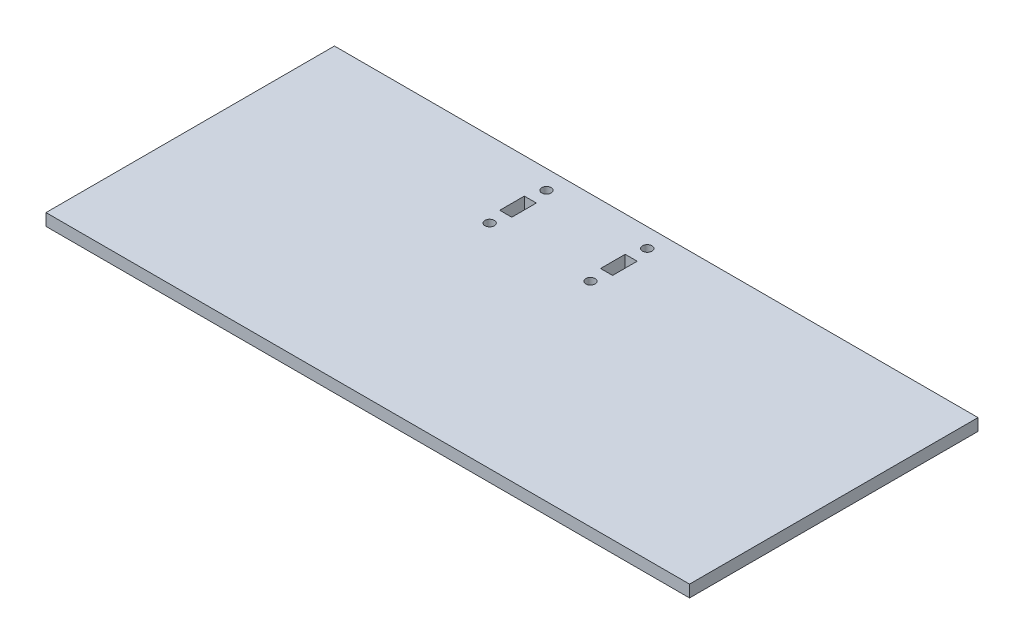
ISO-10303-21;
HEADER;
FILE_DESCRIPTION(('STEP AP214'),'2;1');
FILE_NAME('part.step','',(''),(''),'','','');
FILE_SCHEMA(('AUTOMOTIVE_DESIGN { 1 0 10303 214 1 1 1 1 }'));
ENDSEC;
DATA;
#1=APPLICATION_CONTEXT('core data for automotive mechanical design processes');
#2=APPLICATION_PROTOCOL_DEFINITION('international standard','automotive_design',2000,#1);
#3=PRODUCT_CONTEXT('',#1,'mechanical');
#4=PRODUCT('Part','Part','',(#3));
#5=PRODUCT_RELATED_PRODUCT_CATEGORY('part','',(#4));
#6=PRODUCT_DEFINITION_FORMATION('','',#4);
#7=PRODUCT_DEFINITION_CONTEXT('part definition',#1,'design');
#8=PRODUCT_DEFINITION('design','',#6,#7);
#9=PRODUCT_DEFINITION_SHAPE('','',#8);
#10=(LENGTH_UNIT() NAMED_UNIT(*) SI_UNIT(.MILLI.,.METRE.));
#11=(NAMED_UNIT(*) PLANE_ANGLE_UNIT() SI_UNIT($,.RADIAN.));
#12=(NAMED_UNIT(*) SI_UNIT($,.STERADIAN.) SOLID_ANGLE_UNIT());
#13=UNCERTAINTY_MEASURE_WITH_UNIT(LENGTH_MEASURE(1.E-05),#10,'distance_accuracy_value','');
#14=(GEOMETRIC_REPRESENTATION_CONTEXT(3) GLOBAL_UNCERTAINTY_ASSIGNED_CONTEXT((#13)) GLOBAL_UNIT_ASSIGNED_CONTEXT((#10,
#11,#12)) REPRESENTATION_CONTEXT('',''));
#15=CARTESIAN_POINT('',(0.,0.,0.));
#16=DIRECTION('',(0.,0.,1.));
#17=DIRECTION('',(1.,0.,0.));
#18=AXIS2_PLACEMENT_3D('',#15,#16,#17);
#19=CARTESIAN_POINT('',(0.,6.35,0.));
#20=DIRECTION('',(0.,-1.,0.));
#21=DIRECTION('',(0.,0.,-1.));
#22=AXIS2_PLACEMENT_3D('',#19,#20,#21);
#23=PLANE('',#22);
#24=DIRECTION('',(0.,0.,1.));
#25=VECTOR('',#24,1.);
#26=CARTESIAN_POINT('',(118.825,6.35,-133.899999934));
#27=LINE('',#26,#25);
#28=CARTESIAN_POINT('',(118.825,6.35,-133.899999934));
#29=VERTEX_POINT('',#28);
#30=CARTESIAN_POINT('',(118.825,6.35,-120.899999934));
#31=VERTEX_POINT('',#30);
#32=EDGE_CURVE('E161',#29,#31,#27,.T.);
#33=ORIENTED_EDGE('',*,*,#32,.F.);
#34=DIRECTION('',(-1.,0.,0.));
#35=VECTOR('',#34,1.);
#36=CARTESIAN_POINT('',(118.825,6.35,-133.899999934));
#37=LINE('',#36,#35);
#38=CARTESIAN_POINT('',(125.175,6.35,-133.899999934));
#39=VERTEX_POINT('',#38);
#40=EDGE_CURVE('E169',#39,#29,#37,.T.);
#41=ORIENTED_EDGE('',*,*,#40,.F.);
#42=DIRECTION('',(0.,0.,-1.));
#43=VECTOR('',#42,1.);
#44=CARTESIAN_POINT('',(125.175,6.35,-133.899999934));
#45=LINE('',#44,#43);
#46=CARTESIAN_POINT('',(125.175,6.35,-120.899999934));
#47=VERTEX_POINT('',#46);
#48=EDGE_CURVE('E166',#47,#39,#45,.T.);
#49=ORIENTED_EDGE('',*,*,#48,.F.);
#50=DIRECTION('',(1.,0.,0.));
#51=VECTOR('',#50,1.);
#52=CARTESIAN_POINT('',(118.825,6.35,-120.899999934));
#53=LINE('',#52,#51);
#54=EDGE_CURVE('E163',#31,#47,#53,.T.);
#55=ORIENTED_EDGE('',*,*,#54,.F.);
#56=EDGE_LOOP('',(#33,#41,#49,#55));
#57=FACE_BOUND('',#56,.T.);
#58=DIRECTION('',(0.,0.,1.));
#59=VECTOR('',#58,1.);
#60=CARTESIAN_POINT('',(0.,6.35,0.));
#61=LINE('',#60,#59);
#62=CARTESIAN_POINT('',(0.,6.35,-152.4));
#63=VERTEX_POINT('',#62);
#64=CARTESIAN_POINT('',(0.,6.35,0.));
#65=VERTEX_POINT('',#64);
#66=EDGE_CURVE('E192',#63,#65,#61,.T.);
#67=ORIENTED_EDGE('',*,*,#66,.T.);
#68=DIRECTION('',(1.,0.,0.));
#69=VECTOR('',#68,1.);
#70=CARTESIAN_POINT('',(0.,6.35,0.));
#71=LINE('',#70,#69);
#72=CARTESIAN_POINT('',(340.,6.35,0.));
#73=VERTEX_POINT('',#72);
#74=EDGE_CURVE('E195',#65,#73,#71,.T.);
#75=ORIENTED_EDGE('',*,*,#74,.T.);
#76=DIRECTION('',(0.,0.,-1.));
#77=VECTOR('',#76,1.);
#78=CARTESIAN_POINT('',(340.,6.35,0.));
#79=LINE('',#78,#77);
#80=CARTESIAN_POINT('',(340.,6.35,-152.4));
#81=VERTEX_POINT('',#80);
#82=EDGE_CURVE('E198',#73,#81,#79,.T.);
#83=ORIENTED_EDGE('',*,*,#82,.T.);
#84=DIRECTION('',(-1.,0.,0.));
#85=VECTOR('',#84,1.);
#86=CARTESIAN_POINT('',(0.,6.35,-152.4));
#87=LINE('',#86,#85);
#88=EDGE_CURVE('E200',#81,#63,#87,.T.);
#89=ORIENTED_EDGE('',*,*,#88,.T.);
#90=EDGE_LOOP('',(#67,#75,#83,#89));
#91=FACE_BOUND('',#90,.T.);
#92=DIRECTION('',(0.,0.,1.));
#93=VECTOR('',#92,1.);
#94=CARTESIAN_POINT('',(172.085007,6.35,-133.899999934));
#95=LINE('',#94,#93);
#96=CARTESIAN_POINT('',(172.085007,6.35,-133.899999934));
#97=VERTEX_POINT('',#96);
#98=CARTESIAN_POINT('',(172.085007,6.35,-120.899999934));
#99=VERTEX_POINT('',#98);
#100=EDGE_CURVE('E122',#97,#99,#95,.T.);
#101=ORIENTED_EDGE('',*,*,#100,.F.);
#102=DIRECTION('',(-1.,0.,0.));
#103=VECTOR('',#102,1.);
#104=CARTESIAN_POINT('',(172.085007,6.35,-133.899999934));
#105=LINE('',#104,#103);
#106=CARTESIAN_POINT('',(178.435007,6.35,-133.899999934));
#107=VERTEX_POINT('',#106);
#108=EDGE_CURVE('E145',#107,#97,#105,.T.);
#109=ORIENTED_EDGE('',*,*,#108,.F.);
#110=DIRECTION('',(0.,0.,-1.));
#111=VECTOR('',#110,1.);
#112=CARTESIAN_POINT('',(178.435007,6.35,-133.899999934));
#113=LINE('',#112,#111);
#114=CARTESIAN_POINT('',(178.435007,6.35,-120.899999934));
#115=VERTEX_POINT('',#114);
#116=EDGE_CURVE('E143',#115,#107,#113,.T.);
#117=ORIENTED_EDGE('',*,*,#116,.F.);
#118=DIRECTION('',(1.,0.,0.));
#119=VECTOR('',#118,1.);
#120=CARTESIAN_POINT('',(172.085007,6.35,-120.899999934));
#121=LINE('',#120,#119);
#122=EDGE_CURVE('E130',#99,#115,#121,.T.);
#123=ORIENTED_EDGE('',*,*,#122,.F.);
#124=EDGE_LOOP('',(#101,#109,#117,#123));
#125=FACE_BOUND('',#124,.T.);
#126=CARTESIAN_POINT('',(122.,6.35,-142.399999934));
#127=DIRECTION('',(0.,1.,0.));
#128=DIRECTION('',(0.,0.,1.));
#129=AXIS2_PLACEMENT_3D('',#126,#127,#128);
#130=CIRCLE('',#129,2.48920000000016);
#131=CARTESIAN_POINT('',(122.,6.35,-139.910799934));
#132=VERTEX_POINT('',#131);
#133=EDGE_CURVE('E151',#132,#132,#130,.T.);
#134=ORIENTED_EDGE('',*,*,#133,.F.);
#135=EDGE_LOOP('',(#134));
#136=FACE_BOUND('',#135,.T.);
#137=CARTESIAN_POINT('',(175.260007,6.35,-142.399999934));
#138=DIRECTION('',(0.,1.,0.));
#139=DIRECTION('',(0.,0.,1.));
#140=AXIS2_PLACEMENT_3D('',#137,#138,#139);
#141=CIRCLE('',#140,2.48920000000017);
#142=CARTESIAN_POINT('',(175.260007,6.35,-139.910799934));
#143=VERTEX_POINT('',#142);
#144=EDGE_CURVE('E331',#143,#143,#141,.T.);
#145=ORIENTED_EDGE('',*,*,#144,.F.);
#146=EDGE_LOOP('',(#145));
#147=FACE_BOUND('',#146,.T.);
#148=CARTESIAN_POINT('',(122.,6.35,-112.39999999));
#149=DIRECTION('',(0.,1.,0.));
#150=DIRECTION('',(0.,0.,1.));
#151=AXIS2_PLACEMENT_3D('',#148,#149,#150);
#152=CIRCLE('',#151,2.48920000000016);
#153=CARTESIAN_POINT('',(122.,6.35,-109.91079999));
#154=VERTEX_POINT('',#153);
#155=EDGE_CURVE('E325',#154,#154,#152,.T.);
#156=ORIENTED_EDGE('',*,*,#155,.F.);
#157=EDGE_LOOP('',(#156));
#158=FACE_BOUND('',#157,.T.);
#159=CARTESIAN_POINT('',(175.260007,6.35,-112.39999999));
#160=DIRECTION('',(0.,1.,0.));
#161=DIRECTION('',(0.,0.,1.));
#162=AXIS2_PLACEMENT_3D('',#159,#160,#161);
#163=CIRCLE('',#162,2.48920000000018);
#164=CARTESIAN_POINT('',(175.260007,6.35,-109.91079999));
#165=VERTEX_POINT('',#164);
#166=EDGE_CURVE('E316',#165,#165,#163,.T.);
#167=ORIENTED_EDGE('',*,*,#166,.F.);
#168=EDGE_LOOP('',(#167));
#169=FACE_BOUND('',#168,.T.);
#170=ADVANCED_FACE('F33',(#57,#91,#125,#136,#147,#158,#169),#23,.F.);
#171=CARTESIAN_POINT('',(0.,0.,0.));
#172=DIRECTION('',(0.,-1.,0.));
#173=DIRECTION('',(0.,0.,-1.));
#174=AXIS2_PLACEMENT_3D('',#171,#172,#173);
#175=PLANE('',#174);
#176=CARTESIAN_POINT('',(122.,0.,-112.39999999));
#177=DIRECTION('',(0.,1.,0.));
#178=DIRECTION('',(0.,0.,1.));
#179=AXIS2_PLACEMENT_3D('',#176,#177,#178);
#180=CIRCLE('',#179,2.48920000000016);
#181=CARTESIAN_POINT('',(122.,0.,-109.91079999));
#182=VERTEX_POINT('',#181);
#183=EDGE_CURVE('E322',#182,#182,#180,.T.);
#184=ORIENTED_EDGE('',*,*,#183,.T.);
#185=EDGE_LOOP('',(#184));
#186=FACE_BOUND('',#185,.T.);
#187=CARTESIAN_POINT('',(122.,0.,-142.399999934));
#188=DIRECTION('',(0.,1.,0.));
#189=DIRECTION('',(0.,0.,1.));
#190=AXIS2_PLACEMENT_3D('',#187,#188,#189);
#191=CIRCLE('',#190,2.48920000000016);
#192=CARTESIAN_POINT('',(122.,0.,-139.910799934));
#193=VERTEX_POINT('',#192);
#194=EDGE_CURVE('E334',#193,#193,#191,.T.);
#195=ORIENTED_EDGE('',*,*,#194,.T.);
#196=EDGE_LOOP('',(#195));
#197=FACE_BOUND('',#196,.T.);
#198=DIRECTION('',(0.,0.,1.));
#199=VECTOR('',#198,1.);
#200=CARTESIAN_POINT('',(0.,0.,0.));
#201=LINE('',#200,#199);
#202=CARTESIAN_POINT('',(0.,0.,-152.4));
#203=VERTEX_POINT('',#202);
#204=CARTESIAN_POINT('',(0.,0.,0.));
#205=VERTEX_POINT('',#204);
#206=EDGE_CURVE('E191',#203,#205,#201,.T.);
#207=ORIENTED_EDGE('',*,*,#206,.F.);
#208=DIRECTION('',(-1.,0.,0.));
#209=VECTOR('',#208,1.);
#210=CARTESIAN_POINT('',(0.,0.,-152.4));
#211=LINE('',#210,#209);
#212=CARTESIAN_POINT('',(340.,0.,-152.4));
#213=VERTEX_POINT('',#212);
#214=EDGE_CURVE('E196',#213,#203,#211,.T.);
#215=ORIENTED_EDGE('',*,*,#214,.F.);
#216=DIRECTION('',(0.,0.,-1.));
#217=VECTOR('',#216,1.);
#218=CARTESIAN_POINT('',(340.,0.,0.));
#219=LINE('',#218,#217);
#220=CARTESIAN_POINT('',(340.,0.,0.));
#221=VERTEX_POINT('',#220);
#222=EDGE_CURVE('E207',#221,#213,#219,.T.);
#223=ORIENTED_EDGE('',*,*,#222,.F.);
#224=DIRECTION('',(1.,0.,0.));
#225=VECTOR('',#224,1.);
#226=CARTESIAN_POINT('',(0.,0.,0.));
#227=LINE('',#226,#225);
#228=EDGE_CURVE('E205',#205,#221,#227,.T.);
#229=ORIENTED_EDGE('',*,*,#228,.F.);
#230=EDGE_LOOP('',(#207,#215,#223,#229));
#231=FACE_BOUND('',#230,.T.);
#232=DIRECTION('',(-1.,0.,0.));
#233=VECTOR('',#232,1.);
#234=CARTESIAN_POINT('',(118.825,0.,-133.899999934));
#235=LINE('',#234,#233);
#236=CARTESIAN_POINT('',(125.175,0.,-133.899999934));
#237=VERTEX_POINT('',#236);
#238=CARTESIAN_POINT('',(118.825,0.,-133.899999934));
#239=VERTEX_POINT('',#238);
#240=EDGE_CURVE('E164',#237,#239,#235,.T.);
#241=ORIENTED_EDGE('',*,*,#240,.T.);
#242=DIRECTION('',(0.,0.,1.));
#243=VECTOR('',#242,1.);
#244=CARTESIAN_POINT('',(118.825,0.,-133.899999934));
#245=LINE('',#244,#243);
#246=CARTESIAN_POINT('',(118.825,0.,-120.899999934));
#247=VERTEX_POINT('',#246);
#248=EDGE_CURVE('E138',#239,#247,#245,.T.);
#249=ORIENTED_EDGE('',*,*,#248,.T.);
#250=DIRECTION('',(1.,0.,0.));
#251=VECTOR('',#250,1.);
#252=CARTESIAN_POINT('',(118.825,0.,-120.899999934));
#253=LINE('',#252,#251);
#254=CARTESIAN_POINT('',(125.175,0.,-120.899999934));
#255=VERTEX_POINT('',#254);
#256=EDGE_CURVE('E174',#247,#255,#253,.T.);
#257=ORIENTED_EDGE('',*,*,#256,.T.);
#258=DIRECTION('',(0.,0.,-1.));
#259=VECTOR('',#258,1.);
#260=CARTESIAN_POINT('',(125.175,0.,-133.899999934));
#261=LINE('',#260,#259);
#262=EDGE_CURVE('E177',#255,#237,#261,.T.);
#263=ORIENTED_EDGE('',*,*,#262,.T.);
#264=EDGE_LOOP('',(#241,#249,#257,#263));
#265=FACE_BOUND('',#264,.T.);
#266=DIRECTION('',(-1.,0.,0.));
#267=VECTOR('',#266,1.);
#268=CARTESIAN_POINT('',(172.085007,0.,-133.899999934));
#269=LINE('',#268,#267);
#270=CARTESIAN_POINT('',(178.435007,0.,-133.899999934));
#271=VERTEX_POINT('',#270);
#272=CARTESIAN_POINT('',(172.085007,0.,-133.899999934));
#273=VERTEX_POINT('',#272);
#274=EDGE_CURVE('E131',#271,#273,#269,.T.);
#275=ORIENTED_EDGE('',*,*,#274,.T.);
#276=DIRECTION('',(0.,0.,1.));
#277=VECTOR('',#276,1.);
#278=CARTESIAN_POINT('',(172.085007,0.,-133.899999934));
#279=LINE('',#278,#277);
#280=CARTESIAN_POINT('',(172.085007,0.,-120.899999934));
#281=VERTEX_POINT('',#280);
#282=EDGE_CURVE('E56',#273,#281,#279,.T.);
#283=ORIENTED_EDGE('',*,*,#282,.T.);
#284=DIRECTION('',(1.,0.,0.));
#285=VECTOR('',#284,1.);
#286=CARTESIAN_POINT('',(172.085007,0.,-120.899999934));
#287=LINE('',#286,#285);
#288=CARTESIAN_POINT('',(178.435007,0.,-120.899999934));
#289=VERTEX_POINT('',#288);
#290=EDGE_CURVE('E137',#281,#289,#287,.T.);
#291=ORIENTED_EDGE('',*,*,#290,.T.);
#292=DIRECTION('',(0.,0.,-1.));
#293=VECTOR('',#292,1.);
#294=CARTESIAN_POINT('',(178.435007,0.,-133.899999934));
#295=LINE('',#294,#293);
#296=EDGE_CURVE('E153',#289,#271,#295,.T.);
#297=ORIENTED_EDGE('',*,*,#296,.T.);
#298=EDGE_LOOP('',(#275,#283,#291,#297));
#299=FACE_BOUND('',#298,.T.);
#300=CARTESIAN_POINT('',(175.260007,0.,-142.399999934));
#301=DIRECTION('',(0.,1.,0.));
#302=DIRECTION('',(0.,0.,1.));
#303=AXIS2_PLACEMENT_3D('',#300,#301,#302);
#304=CIRCLE('',#303,2.48920000000017);
#305=CARTESIAN_POINT('',(175.260007,0.,-139.910799934));
#306=VERTEX_POINT('',#305);
#307=EDGE_CURVE('E328',#306,#306,#304,.T.);
#308=ORIENTED_EDGE('',*,*,#307,.T.);
#309=EDGE_LOOP('',(#308));
#310=FACE_BOUND('',#309,.T.);
#311=CARTESIAN_POINT('',(175.260007,0.,-112.39999999));
#312=DIRECTION('',(0.,1.,0.));
#313=DIRECTION('',(0.,0.,1.));
#314=AXIS2_PLACEMENT_3D('',#311,#312,#313);
#315=CIRCLE('',#314,2.48920000000018);
#316=CARTESIAN_POINT('',(175.260007,0.,-109.91079999));
#317=VERTEX_POINT('',#316);
#318=EDGE_CURVE('E319',#317,#317,#315,.T.);
#319=ORIENTED_EDGE('',*,*,#318,.T.);
#320=EDGE_LOOP('',(#319));
#321=FACE_BOUND('',#320,.T.);
#322=ADVANCED_FACE('F225',(#186,#197,#231,#265,#299,#310,#321),#175,.T.);
#323=CARTESIAN_POINT('',(0.,6.35,0.));
#324=DIRECTION('',(1.,0.,0.));
#325=DIRECTION('',(0.,0.,-1.));
#326=AXIS2_PLACEMENT_3D('',#323,#324,#325);
#327=PLANE('',#326);
#328=ORIENTED_EDGE('',*,*,#206,.T.);
#329=DIRECTION('',(0.,-1.,0.));
#330=VECTOR('',#329,1.);
#331=CARTESIAN_POINT('',(0.,6.35,0.));
#332=LINE('',#331,#330);
#333=EDGE_CURVE('E11',#65,#205,#332,.T.);
#334=ORIENTED_EDGE('',*,*,#333,.F.);
#335=ORIENTED_EDGE('',*,*,#66,.F.);
#336=DIRECTION('',(0.,-1.,0.));
#337=VECTOR('',#336,1.);
#338=CARTESIAN_POINT('',(0.,6.35,-152.4));
#339=LINE('',#338,#337);
#340=EDGE_CURVE('E202',#63,#203,#339,.T.);
#341=ORIENTED_EDGE('',*,*,#340,.T.);
#342=EDGE_LOOP('',(#328,#334,#335,#341));
#343=FACE_BOUND('',#342,.T.);
#344=ADVANCED_FACE('F35',(#343),#327,.F.);
#345=CARTESIAN_POINT('',(0.,6.35,0.));
#346=DIRECTION('',(0.,0.,-1.));
#347=DIRECTION('',(-1.,0.,0.));
#348=AXIS2_PLACEMENT_3D('',#345,#346,#347);
#349=PLANE('',#348);
#350=ORIENTED_EDGE('',*,*,#228,.T.);
#351=DIRECTION('',(0.,-1.,0.));
#352=VECTOR('',#351,1.);
#353=CARTESIAN_POINT('',(340.,6.35,0.));
#354=LINE('',#353,#352);
#355=EDGE_CURVE('E41',#73,#221,#354,.T.);
#356=ORIENTED_EDGE('',*,*,#355,.F.);
#357=ORIENTED_EDGE('',*,*,#74,.F.);
#358=ORIENTED_EDGE('',*,*,#333,.T.);
#359=EDGE_LOOP('',(#350,#356,#357,#358));
#360=FACE_BOUND('',#359,.T.);
#361=ADVANCED_FACE('F235',(#360),#349,.F.);
#362=CARTESIAN_POINT('',(340.,6.35,0.));
#363=DIRECTION('',(-1.,0.,0.));
#364=DIRECTION('',(0.,0.,1.));
#365=AXIS2_PLACEMENT_3D('',#362,#363,#364);
#366=PLANE('',#365);
#367=ORIENTED_EDGE('',*,*,#222,.T.);
#368=DIRECTION('',(0.,-1.,0.));
#369=VECTOR('',#368,1.);
#370=CARTESIAN_POINT('',(340.,6.35,-152.4));
#371=LINE('',#370,#369);
#372=EDGE_CURVE('E212',#81,#213,#371,.T.);
#373=ORIENTED_EDGE('',*,*,#372,.F.);
#374=ORIENTED_EDGE('',*,*,#82,.F.);
#375=ORIENTED_EDGE('',*,*,#355,.T.);
#376=EDGE_LOOP('',(#367,#373,#374,#375));
#377=FACE_BOUND('',#376,.T.);
#378=ADVANCED_FACE('F219',(#377),#366,.F.);
#379=CARTESIAN_POINT('',(0.,6.35,-152.4));
#380=DIRECTION('',(0.,0.,1.));
#381=DIRECTION('',(1.,0.,0.));
#382=AXIS2_PLACEMENT_3D('',#379,#380,#381);
#383=PLANE('',#382);
#384=ORIENTED_EDGE('',*,*,#214,.T.);
#385=ORIENTED_EDGE('',*,*,#340,.F.);
#386=ORIENTED_EDGE('',*,*,#88,.F.);
#387=ORIENTED_EDGE('',*,*,#372,.T.);
#388=EDGE_LOOP('',(#384,#385,#386,#387));
#389=FACE_BOUND('',#388,.T.);
#390=ADVANCED_FACE('F229',(#389),#383,.F.);
#391=CARTESIAN_POINT('',(118.825,6.35,-133.899999934));
#392=DIRECTION('',(1.,0.,0.));
#393=DIRECTION('',(0.,0.,-1.));
#394=AXIS2_PLACEMENT_3D('',#391,#392,#393);
#395=PLANE('',#394);
#396=ORIENTED_EDGE('',*,*,#248,.F.);
#397=DIRECTION('',(0.,-1.,0.));
#398=VECTOR('',#397,1.);
#399=CARTESIAN_POINT('',(118.825,6.35,-133.899999934));
#400=LINE('',#399,#398);
#401=EDGE_CURVE('E171',#29,#239,#400,.T.);
#402=ORIENTED_EDGE('',*,*,#401,.F.);
#403=ORIENTED_EDGE('',*,*,#32,.T.);
#404=DIRECTION('',(0.,-1.,0.));
#405=VECTOR('',#404,1.);
#406=CARTESIAN_POINT('',(118.825,6.35,-120.899999934));
#407=LINE('',#406,#405);
#408=EDGE_CURVE('E188',#31,#247,#407,.T.);
#409=ORIENTED_EDGE('',*,*,#408,.T.);
#410=EDGE_LOOP('',(#396,#402,#403,#409));
#411=FACE_BOUND('',#410,.T.);
#412=ADVANCED_FACE('F252',(#411),#395,.T.);
#413=CARTESIAN_POINT('',(118.825,6.35,-120.899999934));
#414=DIRECTION('',(0.,0.,-1.));
#415=DIRECTION('',(-1.,0.,0.));
#416=AXIS2_PLACEMENT_3D('',#413,#414,#415);
#417=PLANE('',#416);
#418=ORIENTED_EDGE('',*,*,#256,.F.);
#419=ORIENTED_EDGE('',*,*,#408,.F.);
#420=ORIENTED_EDGE('',*,*,#54,.T.);
#421=DIRECTION('',(0.,-1.,0.));
#422=VECTOR('',#421,1.);
#423=CARTESIAN_POINT('',(125.175,6.35,-120.899999934));
#424=LINE('',#423,#422);
#425=EDGE_CURVE('E186',#47,#255,#424,.T.);
#426=ORIENTED_EDGE('',*,*,#425,.T.);
#427=EDGE_LOOP('',(#418,#419,#420,#426));
#428=FACE_BOUND('',#427,.T.);
#429=ADVANCED_FACE('F259',(#428),#417,.T.);
#430=CARTESIAN_POINT('',(125.175,6.35,-133.899999934));
#431=DIRECTION('',(-1.,0.,0.));
#432=DIRECTION('',(0.,0.,1.));
#433=AXIS2_PLACEMENT_3D('',#430,#431,#432);
#434=PLANE('',#433);
#435=ORIENTED_EDGE('',*,*,#262,.F.);
#436=ORIENTED_EDGE('',*,*,#425,.F.);
#437=ORIENTED_EDGE('',*,*,#48,.T.);
#438=DIRECTION('',(0.,-1.,0.));
#439=VECTOR('',#438,1.);
#440=CARTESIAN_POINT('',(125.175,6.35,-133.899999934));
#441=LINE('',#440,#439);
#442=EDGE_CURVE('E184',#39,#237,#441,.T.);
#443=ORIENTED_EDGE('',*,*,#442,.T.);
#444=EDGE_LOOP('',(#435,#436,#437,#443));
#445=FACE_BOUND('',#444,.T.);
#446=ADVANCED_FACE('F264',(#445),#434,.T.);
#447=CARTESIAN_POINT('',(118.825,6.35,-133.899999934));
#448=DIRECTION('',(0.,0.,1.));
#449=DIRECTION('',(1.,0.,0.));
#450=AXIS2_PLACEMENT_3D('',#447,#448,#449);
#451=PLANE('',#450);
#452=ORIENTED_EDGE('',*,*,#240,.F.);
#453=ORIENTED_EDGE('',*,*,#442,.F.);
#454=ORIENTED_EDGE('',*,*,#40,.T.);
#455=ORIENTED_EDGE('',*,*,#401,.T.);
#456=EDGE_LOOP('',(#452,#453,#454,#455));
#457=FACE_BOUND('',#456,.T.);
#458=ADVANCED_FACE('F270',(#457),#451,.T.);
#459=CARTESIAN_POINT('',(172.085007,6.35,-133.899999934));
#460=DIRECTION('',(1.,0.,0.));
#461=DIRECTION('',(0.,0.,-1.));
#462=AXIS2_PLACEMENT_3D('',#459,#460,#461);
#463=PLANE('',#462);
#464=ORIENTED_EDGE('',*,*,#282,.F.);
#465=DIRECTION('',(0.,-1.,0.));
#466=VECTOR('',#465,1.);
#467=CARTESIAN_POINT('',(172.085007,6.35,-133.899999934));
#468=LINE('',#467,#466);
#469=EDGE_CURVE('E126',#97,#273,#468,.T.);
#470=ORIENTED_EDGE('',*,*,#469,.F.);
#471=ORIENTED_EDGE('',*,*,#100,.T.);
#472=DIRECTION('',(0.,-1.,0.));
#473=VECTOR('',#472,1.);
#474=CARTESIAN_POINT('',(172.085007,6.35,-120.899999934));
#475=LINE('',#474,#473);
#476=EDGE_CURVE('E125',#99,#281,#475,.T.);
#477=ORIENTED_EDGE('',*,*,#476,.T.);
#478=EDGE_LOOP('',(#464,#470,#471,#477));
#479=FACE_BOUND('',#478,.T.);
#480=ADVANCED_FACE('F124',(#479),#463,.T.);
#481=CARTESIAN_POINT('',(172.085007,6.35,-120.899999934));
#482=DIRECTION('',(0.,0.,-1.));
#483=DIRECTION('',(-1.,0.,0.));
#484=AXIS2_PLACEMENT_3D('',#481,#482,#483);
#485=PLANE('',#484);
#486=ORIENTED_EDGE('',*,*,#290,.F.);
#487=ORIENTED_EDGE('',*,*,#476,.F.);
#488=ORIENTED_EDGE('',*,*,#122,.T.);
#489=DIRECTION('',(0.,-1.,0.));
#490=VECTOR('',#489,1.);
#491=CARTESIAN_POINT('',(178.435007,6.35,-120.899999934));
#492=LINE('',#491,#490);
#493=EDGE_CURVE('E139',#115,#289,#492,.T.);
#494=ORIENTED_EDGE('',*,*,#493,.T.);
#495=EDGE_LOOP('',(#486,#487,#488,#494));
#496=FACE_BOUND('',#495,.T.);
#497=ADVANCED_FACE('F134',(#496),#485,.T.);
#498=CARTESIAN_POINT('',(178.435007,6.35,-133.899999934));
#499=DIRECTION('',(-1.,0.,0.));
#500=DIRECTION('',(0.,0.,1.));
#501=AXIS2_PLACEMENT_3D('',#498,#499,#500);
#502=PLANE('',#501);
#503=ORIENTED_EDGE('',*,*,#296,.F.);
#504=ORIENTED_EDGE('',*,*,#493,.F.);
#505=ORIENTED_EDGE('',*,*,#116,.T.);
#506=DIRECTION('',(0.,-1.,0.));
#507=VECTOR('',#506,1.);
#508=CARTESIAN_POINT('',(178.435007,6.35,-133.899999934));
#509=LINE('',#508,#507);
#510=EDGE_CURVE('E48',#107,#271,#509,.T.);
#511=ORIENTED_EDGE('',*,*,#510,.T.);
#512=EDGE_LOOP('',(#503,#504,#505,#511));
#513=FACE_BOUND('',#512,.T.);
#514=ADVANCED_FACE('F289',(#513),#502,.T.);
#515=CARTESIAN_POINT('',(172.085007,6.35,-133.899999934));
#516=DIRECTION('',(0.,0.,1.));
#517=DIRECTION('',(1.,0.,0.));
#518=AXIS2_PLACEMENT_3D('',#515,#516,#517);
#519=PLANE('',#518);
#520=ORIENTED_EDGE('',*,*,#274,.F.);
#521=ORIENTED_EDGE('',*,*,#510,.F.);
#522=ORIENTED_EDGE('',*,*,#108,.T.);
#523=ORIENTED_EDGE('',*,*,#469,.T.);
#524=EDGE_LOOP('',(#520,#521,#522,#523));
#525=FACE_BOUND('',#524,.T.);
#526=ADVANCED_FACE('F292',(#525),#519,.T.);
#527=CARTESIAN_POINT('',(122.,6.35,-142.399999934));
#528=DIRECTION('',(0.,-1.,0.));
#529=DIRECTION('',(0.,0.,-1.));
#530=AXIS2_PLACEMENT_3D('',#527,#528,#529);
#531=CYLINDRICAL_SURFACE('',#530,2.48920000000016);
#532=ORIENTED_EDGE('',*,*,#133,.T.);
#533=EDGE_LOOP('',(#532));
#534=FACE_BOUND('',#533,.T.);
#535=ORIENTED_EDGE('',*,*,#194,.F.);
#536=EDGE_LOOP('',(#535));
#537=FACE_BOUND('',#536,.T.);
#538=ADVANCED_FACE('F296',(#534,#537),#531,.F.);
#539=CARTESIAN_POINT('',(175.260007,6.35,-142.399999934));
#540=DIRECTION('',(0.,-1.,0.));
#541=DIRECTION('',(0.,0.,-1.));
#542=AXIS2_PLACEMENT_3D('',#539,#540,#541);
#543=CYLINDRICAL_SURFACE('',#542,2.48920000000017);
#544=ORIENTED_EDGE('',*,*,#144,.T.);
#545=EDGE_LOOP('',(#544));
#546=FACE_BOUND('',#545,.T.);
#547=ORIENTED_EDGE('',*,*,#307,.F.);
#548=EDGE_LOOP('',(#547));
#549=FACE_BOUND('',#548,.T.);
#550=ADVANCED_FACE('F299',(#546,#549),#543,.F.);
#551=CARTESIAN_POINT('',(122.,6.35,-112.39999999));
#552=DIRECTION('',(0.,-1.,0.));
#553=DIRECTION('',(0.,0.,-1.));
#554=AXIS2_PLACEMENT_3D('',#551,#552,#553);
#555=CYLINDRICAL_SURFACE('',#554,2.48920000000016);
#556=ORIENTED_EDGE('',*,*,#155,.T.);
#557=EDGE_LOOP('',(#556));
#558=FACE_BOUND('',#557,.T.);
#559=ORIENTED_EDGE('',*,*,#183,.F.);
#560=EDGE_LOOP('',(#559));
#561=FACE_BOUND('',#560,.T.);
#562=ADVANCED_FACE('F303',(#558,#561),#555,.F.);
#563=CARTESIAN_POINT('',(175.260007,6.35,-112.39999999));
#564=DIRECTION('',(0.,-1.,0.));
#565=DIRECTION('',(0.,0.,-1.));
#566=AXIS2_PLACEMENT_3D('',#563,#564,#565);
#567=CYLINDRICAL_SURFACE('',#566,2.48920000000018);
#568=ORIENTED_EDGE('',*,*,#166,.T.);
#569=EDGE_LOOP('',(#568));
#570=FACE_BOUND('',#569,.T.);
#571=ORIENTED_EDGE('',*,*,#318,.F.);
#572=EDGE_LOOP('',(#571));
#573=FACE_BOUND('',#572,.T.);
#574=ADVANCED_FACE('F307',(#570,#573),#567,.F.);
#575=CLOSED_SHELL('',(#170,#322,#344,#361,#378,#390,#412,#429,#446,#458,#480,#497,#514,#526,
#538,#550,#562,#574));
#576=MANIFOLD_SOLID_BREP('B2',#575);
#577=ADVANCED_BREP_SHAPE_REPRESENTATION('',(#18,#576),#14);
#578=SHAPE_DEFINITION_REPRESENTATION(#9,#577);
ENDSEC;
END-ISO-10303-21;
